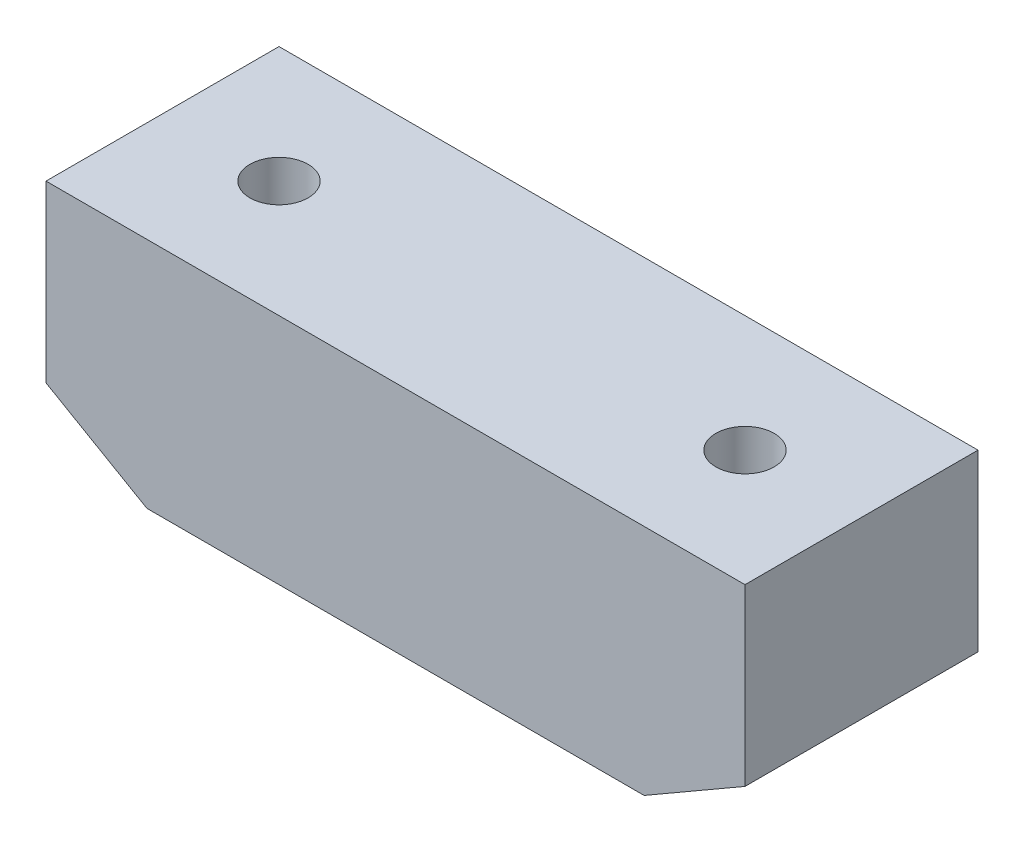
ISO-10303-21;
HEADER;
FILE_DESCRIPTION(('STEP AP214'),'2;1');
FILE_NAME('part.step','',(''),(''),'','','');
FILE_SCHEMA(('AUTOMOTIVE_DESIGN { 1 0 10303 214 1 1 1 1 }'));
ENDSEC;
DATA;
#1=APPLICATION_CONTEXT('core data for automotive mechanical design processes');
#2=APPLICATION_PROTOCOL_DEFINITION('international standard','automotive_design',2000,#1);
#3=PRODUCT_CONTEXT('',#1,'mechanical');
#4=PRODUCT('Part','Part','',(#3));
#5=PRODUCT_RELATED_PRODUCT_CATEGORY('part','',(#4));
#6=PRODUCT_DEFINITION_FORMATION('','',#4);
#7=PRODUCT_DEFINITION_CONTEXT('part definition',#1,'design');
#8=PRODUCT_DEFINITION('design','',#6,#7);
#9=PRODUCT_DEFINITION_SHAPE('','',#8);
#10=(LENGTH_UNIT() NAMED_UNIT(*) SI_UNIT(.MILLI.,.METRE.));
#11=(NAMED_UNIT(*) PLANE_ANGLE_UNIT() SI_UNIT($,.RADIAN.));
#12=(NAMED_UNIT(*) SI_UNIT($,.STERADIAN.) SOLID_ANGLE_UNIT());
#13=UNCERTAINTY_MEASURE_WITH_UNIT(LENGTH_MEASURE(1.E-05),#10,'distance_accuracy_value','');
#14=(GEOMETRIC_REPRESENTATION_CONTEXT(3) GLOBAL_UNCERTAINTY_ASSIGNED_CONTEXT((#13)) GLOBAL_UNIT_ASSIGNED_CONTEXT((#10,
#11,#12)) REPRESENTATION_CONTEXT('',''));
#15=CARTESIAN_POINT('',(0.,0.,0.));
#16=DIRECTION('',(0.,0.,1.));
#17=DIRECTION('',(1.,0.,0.));
#18=AXIS2_PLACEMENT_3D('',#15,#16,#17);
#19=CARTESIAN_POINT('',(-20.,-4.99999999993861,0.));
#20=DIRECTION('',(0.,1.,0.));
#21=DIRECTION('',(0.,0.,1.));
#22=AXIS2_PLACEMENT_3D('',#19,#20,#21);
#23=CONICAL_SURFACE('',#22,2.49999999999772,1.0297442586719);
#24=CARTESIAN_POINT('',(-20.,-6.50215154752232,0.));
#25=VERTEX_POINT('',#24);
#26=VERTEX_LOOP('',#25);
#27=FACE_BOUND('',#26,.T.);
#28=CARTESIAN_POINT('',(-20.,-5.,0.));
#29=DIRECTION('',(0.,1.,0.));
#30=DIRECTION('',(0.,0.,1.));
#31=AXIS2_PLACEMENT_3D('',#28,#29,#30);
#32=CIRCLE('',#31,2.5);
#33=CARTESIAN_POINT('',(-20.,-5.,2.5));
#34=VERTEX_POINT('',#33);
#35=EDGE_CURVE('E77',#34,#34,#32,.T.);
#36=ORIENTED_EDGE('',*,*,#35,.T.);
#37=EDGE_LOOP('',(#36));
#38=FACE_BOUND('',#37,.T.);
#39=ADVANCED_FACE('F17',(#27,#38),#23,.F.);
#40=CARTESIAN_POINT('',(20.,-4.99999999993861,0.));
#41=DIRECTION('',(0.,1.,0.));
#42=DIRECTION('',(0.,0.,1.));
#43=AXIS2_PLACEMENT_3D('',#40,#41,#42);
#44=CONICAL_SURFACE('',#43,2.49999999999772,1.0297442586719);
#45=CARTESIAN_POINT('',(20.,-6.50215154752232,-1.13686837721616E-10));
#46=VERTEX_POINT('',#45);
#47=VERTEX_LOOP('',#46);
#48=FACE_BOUND('',#47,.T.);
#49=CARTESIAN_POINT('',(20.,-5.,0.));
#50=DIRECTION('',(0.,1.,0.));
#51=DIRECTION('',(0.,0.,1.));
#52=AXIS2_PLACEMENT_3D('',#49,#50,#51);
#53=CIRCLE('',#52,2.5);
#54=CARTESIAN_POINT('',(20.,-5.,2.5));
#55=VERTEX_POINT('',#54);
#56=EDGE_CURVE('E79',#55,#55,#53,.T.);
#57=ORIENTED_EDGE('',*,*,#56,.T.);
#58=EDGE_LOOP('',(#57));
#59=FACE_BOUND('',#58,.T.);
#60=ADVANCED_FACE('F74',(#48,#59),#44,.F.);
#61=CARTESIAN_POINT('',(30.,-5.,10.));
#62=DIRECTION('',(-0.5,0.866025403784438,0.));
#63=DIRECTION('',(-0.866025403784438,-0.5,0.));
#64=AXIS2_PLACEMENT_3D('',#61,#62,#63);
#65=PLANE('',#64);
#66=DIRECTION('',(0.,0.,1.));
#67=VECTOR('',#66,1.);
#68=CARTESIAN_POINT('',(21.3397459621556,-10.,10.));
#69=LINE('',#68,#67);
#70=CARTESIAN_POINT('',(21.3397459621556,-10.,10.));
#71=VERTEX_POINT('',#70);
#72=CARTESIAN_POINT('',(21.3397459621557,-10.,-10.));
#73=VERTEX_POINT('',#72);
#74=EDGE_CURVE('E86',#71,#73,#69,.F.);
#75=ORIENTED_EDGE('',*,*,#74,.T.);
#76=DIRECTION('',(-0.866025403784438,-0.5,0.));
#77=VECTOR('',#76,1.);
#78=CARTESIAN_POINT('',(30.,-5.,-10.));
#79=LINE('',#78,#77);
#80=CARTESIAN_POINT('',(30.,-5.,-10.));
#81=VERTEX_POINT('',#80);
#82=EDGE_CURVE('E107',#81,#73,#79,.T.);
#83=ORIENTED_EDGE('',*,*,#82,.F.);
#84=DIRECTION('',(0.,0.,1.));
#85=VECTOR('',#84,1.);
#86=CARTESIAN_POINT('',(30.,-5.,10.));
#87=LINE('',#86,#85);
#88=CARTESIAN_POINT('',(30.,-5.,10.));
#89=VERTEX_POINT('',#88);
#90=EDGE_CURVE('E83',#81,#89,#87,.T.);
#91=ORIENTED_EDGE('',*,*,#90,.T.);
#92=DIRECTION('',(-0.866025403784438,-0.5,0.));
#93=VECTOR('',#92,1.);
#94=CARTESIAN_POINT('',(30.,-5.,10.));
#95=LINE('',#94,#93);
#96=EDGE_CURVE('E121',#89,#71,#95,.T.);
#97=ORIENTED_EDGE('',*,*,#96,.T.);
#98=EDGE_LOOP('',(#75,#83,#91,#97));
#99=FACE_BOUND('',#98,.T.);
#100=ADVANCED_FACE('F133',(#99),#65,.F.);
#101=CARTESIAN_POINT('',(-30.,-10.,10.));
#102=DIRECTION('',(0.,1.,0.));
#103=DIRECTION('',(0.,0.,1.));
#104=AXIS2_PLACEMENT_3D('',#101,#102,#103);
#105=PLANE('',#104);
#106=ORIENTED_EDGE('',*,*,#74,.F.);
#107=DIRECTION('',(-1.,0.,0.));
#108=VECTOR('',#107,1.);
#109=CARTESIAN_POINT('',(0.,-10.,10.));
#110=LINE('',#109,#108);
#111=CARTESIAN_POINT('',(-21.3397459621557,-10.,10.));
#112=VERTEX_POINT('',#111);
#113=EDGE_CURVE('E118',#71,#112,#110,.T.);
#114=ORIENTED_EDGE('',*,*,#113,.T.);
#115=DIRECTION('',(0.,0.,1.));
#116=VECTOR('',#115,1.);
#117=CARTESIAN_POINT('',(-21.3397459621557,-10.,10.));
#118=LINE('',#117,#116);
#119=CARTESIAN_POINT('',(-21.3397459621557,-10.,-10.));
#120=VERTEX_POINT('',#119);
#121=EDGE_CURVE('E80',#112,#120,#118,.F.);
#122=ORIENTED_EDGE('',*,*,#121,.T.);
#123=DIRECTION('',(-1.,0.,0.));
#124=VECTOR('',#123,1.);
#125=CARTESIAN_POINT('',(0.,-10.,-10.));
#126=LINE('',#125,#124);
#127=EDGE_CURVE('E102',#73,#120,#126,.T.);
#128=ORIENTED_EDGE('',*,*,#127,.F.);
#129=EDGE_LOOP('',(#106,#114,#122,#128));
#130=FACE_BOUND('',#129,.T.);
#131=ADVANCED_FACE('F137',(#130),#105,.F.);
#132=CARTESIAN_POINT('',(-21.3397459621556,-10.,10.));
#133=DIRECTION('',(0.5,0.866025403784438,0.));
#134=DIRECTION('',(-0.866025403784438,0.5,0.));
#135=AXIS2_PLACEMENT_3D('',#132,#133,#134);
#136=PLANE('',#135);
#137=DIRECTION('',(0.,0.,-1.));
#138=VECTOR('',#137,1.);
#139=CARTESIAN_POINT('',(-30.,-5.,10.));
#140=LINE('',#139,#138);
#141=CARTESIAN_POINT('',(-30.,-5.,10.));
#142=VERTEX_POINT('',#141);
#143=CARTESIAN_POINT('',(-30.,-5.,-10.));
#144=VERTEX_POINT('',#143);
#145=EDGE_CURVE('E112',#142,#144,#140,.T.);
#146=ORIENTED_EDGE('',*,*,#145,.T.);
#147=DIRECTION('',(-0.866025403784438,0.5,0.));
#148=VECTOR('',#147,1.);
#149=CARTESIAN_POINT('',(-21.3397459621557,-10.,-10.));
#150=LINE('',#149,#148);
#151=EDGE_CURVE('E100',#120,#144,#150,.T.);
#152=ORIENTED_EDGE('',*,*,#151,.F.);
#153=ORIENTED_EDGE('',*,*,#121,.F.);
#154=DIRECTION('',(-0.866025403784438,0.5,0.));
#155=VECTOR('',#154,1.);
#156=CARTESIAN_POINT('',(-21.3397459621557,-10.,10.));
#157=LINE('',#156,#155);
#158=EDGE_CURVE('E127',#112,#142,#157,.T.);
#159=ORIENTED_EDGE('',*,*,#158,.T.);
#160=EDGE_LOOP('',(#146,#152,#153,#159));
#161=FACE_BOUND('',#160,.T.);
#162=ADVANCED_FACE('F150',(#161),#136,.F.);
#163=CARTESIAN_POINT('',(-20.,10.,0.));
#164=DIRECTION('',(0.,1.,0.));
#165=DIRECTION('',(0.,0.,1.));
#166=AXIS2_PLACEMENT_3D('',#163,#164,#165);
#167=CYLINDRICAL_SURFACE('',#166,2.5);
#168=ORIENTED_EDGE('',*,*,#35,.F.);
#169=EDGE_LOOP('',(#168));
#170=FACE_BOUND('',#169,.T.);
#171=CARTESIAN_POINT('',(-20.,10.,0.));
#172=DIRECTION('',(0.,1.,0.));
#173=DIRECTION('',(0.,0.,1.));
#174=AXIS2_PLACEMENT_3D('',#171,#172,#173);
#175=CIRCLE('',#174,2.5);
#176=CARTESIAN_POINT('',(-20.,10.,2.5));
#177=VERTEX_POINT('',#176);
#178=EDGE_CURVE('E20',#177,#177,#175,.T.);
#179=ORIENTED_EDGE('',*,*,#178,.T.);
#180=EDGE_LOOP('',(#179));
#181=FACE_BOUND('',#180,.T.);
#182=ADVANCED_FACE('F178',(#170,#181),#167,.F.);
#183=CARTESIAN_POINT('',(20.,10.,0.));
#184=DIRECTION('',(0.,1.,0.));
#185=DIRECTION('',(0.,0.,1.));
#186=AXIS2_PLACEMENT_3D('',#183,#184,#185);
#187=CYLINDRICAL_SURFACE('',#186,2.5);
#188=ORIENTED_EDGE('',*,*,#56,.F.);
#189=EDGE_LOOP('',(#188));
#190=FACE_BOUND('',#189,.T.);
#191=CARTESIAN_POINT('',(20.,10.,0.));
#192=DIRECTION('',(0.,1.,0.));
#193=DIRECTION('',(0.,0.,1.));
#194=AXIS2_PLACEMENT_3D('',#191,#192,#193);
#195=CIRCLE('',#194,2.5);
#196=CARTESIAN_POINT('',(20.,10.,2.5));
#197=VERTEX_POINT('',#196);
#198=EDGE_CURVE('E89',#197,#197,#195,.T.);
#199=ORIENTED_EDGE('',*,*,#198,.T.);
#200=EDGE_LOOP('',(#199));
#201=FACE_BOUND('',#200,.T.);
#202=ADVANCED_FACE('F175',(#190,#201),#187,.F.);
#203=CARTESIAN_POINT('',(30.,-10.,10.));
#204=DIRECTION('',(-1.,0.,0.));
#205=DIRECTION('',(0.,0.,1.));
#206=AXIS2_PLACEMENT_3D('',#203,#204,#205);
#207=PLANE('',#206);
#208=ORIENTED_EDGE('',*,*,#90,.F.);
#209=DIRECTION('',(0.,1.,0.));
#210=VECTOR('',#209,1.);
#211=CARTESIAN_POINT('',(30.,0.,-10.));
#212=LINE('',#211,#210);
#213=CARTESIAN_POINT('',(30.,10.,-10.));
#214=VERTEX_POINT('',#213);
#215=EDGE_CURVE('E109',#214,#81,#212,.F.);
#216=ORIENTED_EDGE('',*,*,#215,.F.);
#217=DIRECTION('',(0.,0.,-1.));
#218=VECTOR('',#217,1.);
#219=CARTESIAN_POINT('',(30.,10.,10.));
#220=LINE('',#219,#218);
#221=CARTESIAN_POINT('',(30.,10.,10.));
#222=VERTEX_POINT('',#221);
#223=EDGE_CURVE('E91',#214,#222,#220,.F.);
#224=ORIENTED_EDGE('',*,*,#223,.T.);
#225=DIRECTION('',(0.,1.,0.));
#226=VECTOR('',#225,1.);
#227=CARTESIAN_POINT('',(30.,0.,10.));
#228=LINE('',#227,#226);
#229=EDGE_CURVE('E124',#222,#89,#228,.F.);
#230=ORIENTED_EDGE('',*,*,#229,.T.);
#231=EDGE_LOOP('',(#208,#216,#224,#230));
#232=FACE_BOUND('',#231,.T.);
#233=ADVANCED_FACE('F142',(#232),#207,.F.);
#234=CARTESIAN_POINT('',(0.,0.,10.));
#235=DIRECTION('',(0.,0.,-1.));
#236=DIRECTION('',(-1.,0.,0.));
#237=AXIS2_PLACEMENT_3D('',#234,#235,#236);
#238=PLANE('',#237);
#239=ORIENTED_EDGE('',*,*,#96,.F.);
#240=ORIENTED_EDGE('',*,*,#229,.F.);
#241=DIRECTION('',(1.,0.,0.));
#242=VECTOR('',#241,1.);
#243=CARTESIAN_POINT('',(-30.,10.,10.));
#244=LINE('',#243,#242);
#245=CARTESIAN_POINT('',(-30.,10.,10.));
#246=VERTEX_POINT('',#245);
#247=EDGE_CURVE('E95',#222,#246,#244,.F.);
#248=ORIENTED_EDGE('',*,*,#247,.T.);
#249=DIRECTION('',(0.,1.,0.));
#250=VECTOR('',#249,1.);
#251=CARTESIAN_POINT('',(-30.,-10.,10.));
#252=LINE('',#251,#250);
#253=EDGE_CURVE('E115',#246,#142,#252,.F.);
#254=ORIENTED_EDGE('',*,*,#253,.T.);
#255=ORIENTED_EDGE('',*,*,#158,.F.);
#256=ORIENTED_EDGE('',*,*,#113,.F.);
#257=EDGE_LOOP('',(#239,#240,#248,#254,#255,#256));
#258=FACE_BOUND('',#257,.T.);
#259=ADVANCED_FACE('F144',(#258),#238,.F.);
#260=CARTESIAN_POINT('',(-30.,-10.,10.));
#261=DIRECTION('',(1.,0.,0.));
#262=DIRECTION('',(0.,0.,-1.));
#263=AXIS2_PLACEMENT_3D('',#260,#261,#262);
#264=PLANE('',#263);
#265=ORIENTED_EDGE('',*,*,#145,.F.);
#266=ORIENTED_EDGE('',*,*,#253,.F.);
#267=DIRECTION('',(0.,0.,-1.));
#268=VECTOR('',#267,1.);
#269=CARTESIAN_POINT('',(-30.,10.,10.));
#270=LINE('',#269,#268);
#271=CARTESIAN_POINT('',(-30.,10.,-10.));
#272=VERTEX_POINT('',#271);
#273=EDGE_CURVE('E26',#246,#272,#270,.T.);
#274=ORIENTED_EDGE('',*,*,#273,.T.);
#275=DIRECTION('',(0.,1.,0.));
#276=VECTOR('',#275,1.);
#277=CARTESIAN_POINT('',(-30.,0.,-10.));
#278=LINE('',#277,#276);
#279=EDGE_CURVE('E34',#144,#272,#278,.T.);
#280=ORIENTED_EDGE('',*,*,#279,.F.);
#281=EDGE_LOOP('',(#265,#266,#274,#280));
#282=FACE_BOUND('',#281,.T.);
#283=ADVANCED_FACE('F152',(#282),#264,.F.);
#284=CARTESIAN_POINT('',(0.,0.,-10.));
#285=DIRECTION('',(0.,0.,-1.));
#286=DIRECTION('',(-1.,0.,0.));
#287=AXIS2_PLACEMENT_3D('',#284,#285,#286);
#288=PLANE('',#287);
#289=ORIENTED_EDGE('',*,*,#279,.T.);
#290=DIRECTION('',(1.,0.,0.));
#291=VECTOR('',#290,1.);
#292=CARTESIAN_POINT('',(-30.,10.,-10.));
#293=LINE('',#292,#291);
#294=EDGE_CURVE('E11',#272,#214,#293,.T.);
#295=ORIENTED_EDGE('',*,*,#294,.T.);
#296=ORIENTED_EDGE('',*,*,#215,.T.);
#297=ORIENTED_EDGE('',*,*,#82,.T.);
#298=ORIENTED_EDGE('',*,*,#127,.T.);
#299=ORIENTED_EDGE('',*,*,#151,.T.);
#300=EDGE_LOOP('',(#289,#295,#296,#297,#298,#299));
#301=FACE_BOUND('',#300,.T.);
#302=ADVANCED_FACE('F139',(#301),#288,.T.);
#303=CARTESIAN_POINT('',(-30.,10.,10.));
#304=DIRECTION('',(0.,-1.,0.));
#305=DIRECTION('',(0.,0.,-1.));
#306=AXIS2_PLACEMENT_3D('',#303,#304,#305);
#307=PLANE('',#306);
#308=ORIENTED_EDGE('',*,*,#273,.F.);
#309=ORIENTED_EDGE('',*,*,#247,.F.);
#310=ORIENTED_EDGE('',*,*,#223,.F.);
#311=ORIENTED_EDGE('',*,*,#294,.F.);
#312=EDGE_LOOP('',(#308,#309,#310,#311));
#313=FACE_BOUND('',#312,.T.);
#314=ORIENTED_EDGE('',*,*,#198,.F.);
#315=EDGE_LOOP('',(#314));
#316=FACE_BOUND('',#315,.T.);
#317=ORIENTED_EDGE('',*,*,#178,.F.);
#318=EDGE_LOOP('',(#317));
#319=FACE_BOUND('',#318,.T.);
#320=ADVANCED_FACE('F157',(#313,#316,#319),#307,.F.);
#321=CLOSED_SHELL('',(#39,#60,#100,#131,#162,#182,#202,#233,#259,#283,#302,#320));
#322=MANIFOLD_SOLID_BREP('B1',#321);
#323=ADVANCED_BREP_SHAPE_REPRESENTATION('',(#18,#322),#14);
#324=SHAPE_DEFINITION_REPRESENTATION(#9,#323);
ENDSEC;
END-ISO-10303-21;
